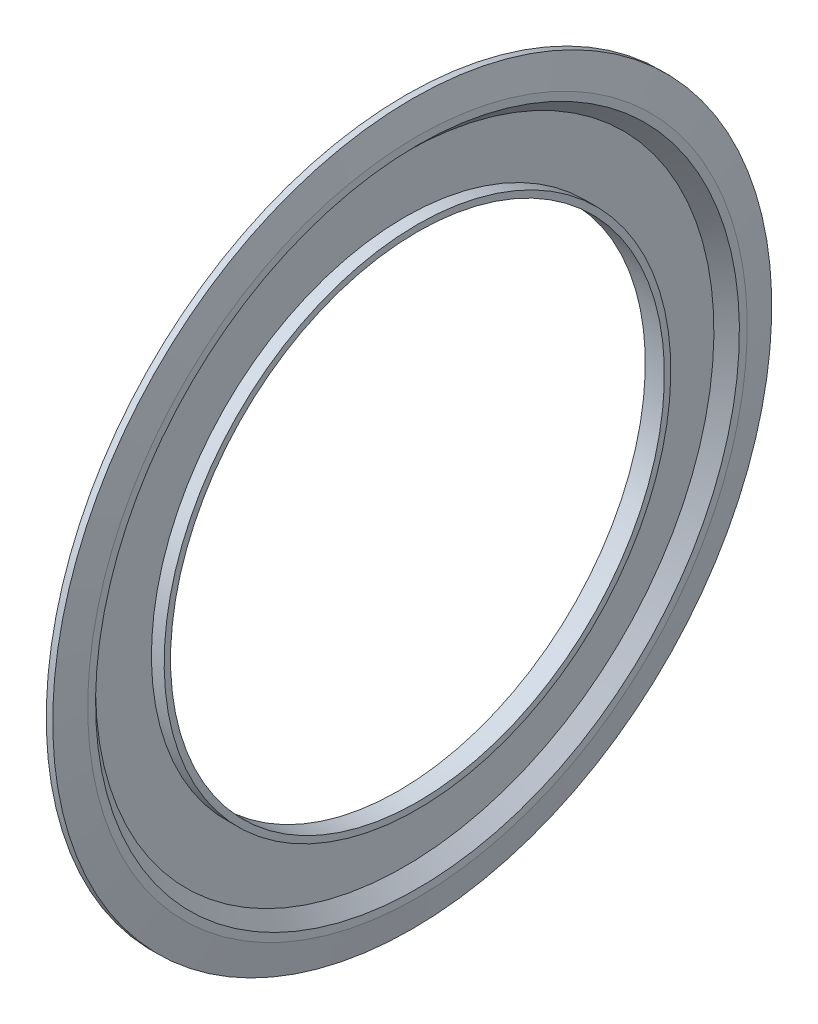
ISO-10303-21;
HEADER;
FILE_DESCRIPTION(('STEP AP214'),'2;1');
FILE_NAME('part.step','',(''),(''),'','','');
FILE_SCHEMA(('AUTOMOTIVE_DESIGN { 1 0 10303 214 1 1 1 1 }'));
ENDSEC;
DATA;
#1=APPLICATION_CONTEXT('core data for automotive mechanical design processes');
#2=APPLICATION_PROTOCOL_DEFINITION('international standard','automotive_design',2000,#1);
#3=PRODUCT_CONTEXT('',#1,'mechanical');
#4=PRODUCT('Part','Part','',(#3));
#5=PRODUCT_RELATED_PRODUCT_CATEGORY('part','',(#4));
#6=PRODUCT_DEFINITION_FORMATION('','',#4);
#7=PRODUCT_DEFINITION_CONTEXT('part definition',#1,'design');
#8=PRODUCT_DEFINITION('design','',#6,#7);
#9=PRODUCT_DEFINITION_SHAPE('','',#8);
#10=(LENGTH_UNIT() NAMED_UNIT(*) SI_UNIT(.MILLI.,.METRE.));
#11=(NAMED_UNIT(*) PLANE_ANGLE_UNIT() SI_UNIT($,.RADIAN.));
#12=(NAMED_UNIT(*) SI_UNIT($,.STERADIAN.) SOLID_ANGLE_UNIT());
#13=UNCERTAINTY_MEASURE_WITH_UNIT(LENGTH_MEASURE(1.E-05),#10,'distance_accuracy_value','');
#14=(GEOMETRIC_REPRESENTATION_CONTEXT(3) GLOBAL_UNCERTAINTY_ASSIGNED_CONTEXT((#13)) GLOBAL_UNIT_ASSIGNED_CONTEXT((#10,
#11,#12)) REPRESENTATION_CONTEXT('',''));
#15=CARTESIAN_POINT('',(0.,0.,0.));
#16=DIRECTION('',(0.,0.,1.));
#17=DIRECTION('',(1.,0.,0.));
#18=AXIS2_PLACEMENT_3D('',#15,#16,#17);
#19=CARTESIAN_POINT('',(1.11496576878358,14.5745,0.));
#20=DIRECTION('',(1.,0.,0.));
#21=DIRECTION('',(0.,-1.,0.));
#22=AXIS2_PLACEMENT_3D('',#19,#20,#21);
#23=PLANE('',#22);
#24=CARTESIAN_POINT('',(1.11496576878358,0.,0.));
#25=DIRECTION('',(-1.,0.,0.));
#26=DIRECTION('',(0.,1.,0.));
#27=AXIS2_PLACEMENT_3D('',#24,#25,#26);
#28=CIRCLE('',#27,14.399);
#29=CARTESIAN_POINT('',(1.11496576878358,14.399,0.));
#30=VERTEX_POINT('',#29);
#31=EDGE_CURVE('E11',#30,#30,#28,.T.);
#32=ORIENTED_EDGE('',*,*,#31,.T.);
#33=EDGE_LOOP('',(#32));
#34=FACE_BOUND('',#33,.T.);
#35=CARTESIAN_POINT('',(1.11496576878358,0.,0.));
#36=DIRECTION('',(-1.,0.,0.));
#37=DIRECTION('',(0.,1.,0.));
#38=AXIS2_PLACEMENT_3D('',#35,#36,#37);
#39=CIRCLE('',#38,14.75);
#40=CARTESIAN_POINT('',(1.11496576878358,14.75,0.));
#41=VERTEX_POINT('',#40);
#42=EDGE_CURVE('E62',#41,#41,#39,.T.);
#43=ORIENTED_EDGE('',*,*,#42,.F.);
#44=EDGE_LOOP('',(#43));
#45=FACE_BOUND('',#44,.T.);
#46=ADVANCED_FACE('F16',(#34,#45),#23,.T.);
#47=CARTESIAN_POINT('',(0.829965768783582,0.,0.));
#48=DIRECTION('',(1.,0.,0.));
#49=DIRECTION('',(0.,1.,0.));
#50=AXIS2_PLACEMENT_3D('',#47,#48,#49);
#51=CONICAL_SURFACE('',#50,14.114,0.785398163397446);
#52=CARTESIAN_POINT('',(0.544965768783584,0.,0.));
#53=DIRECTION('',(-1.,0.,0.));
#54=DIRECTION('',(0.,1.,0.));
#55=AXIS2_PLACEMENT_3D('',#52,#53,#54);
#56=CIRCLE('',#55,13.829);
#57=CARTESIAN_POINT('',(0.544965768783584,13.829,0.));
#58=VERTEX_POINT('',#57);
#59=EDGE_CURVE('E26',#58,#58,#56,.T.);
#60=ORIENTED_EDGE('',*,*,#59,.T.);
#61=EDGE_LOOP('',(#60));
#62=FACE_BOUND('',#61,.T.);
#63=ORIENTED_EDGE('',*,*,#31,.F.);
#64=EDGE_LOOP('',(#63));
#65=FACE_BOUND('',#64,.T.);
#66=ADVANCED_FACE('F84',(#62,#65),#51,.F.);
#67=CARTESIAN_POINT('',(0.544965768783584,12.5795,0.));
#68=DIRECTION('',(1.,0.,0.));
#69=DIRECTION('',(0.,-1.,0.));
#70=AXIS2_PLACEMENT_3D('',#67,#68,#69);
#71=PLANE('',#70);
#72=CARTESIAN_POINT('',(0.544965768783582,0.,0.));
#73=DIRECTION('',(-1.,0.,0.));
#74=DIRECTION('',(0.,1.,0.));
#75=AXIS2_PLACEMENT_3D('',#72,#73,#74);
#76=CIRCLE('',#75,11.33);
#77=CARTESIAN_POINT('',(0.544965768783582,11.33,0.));
#78=VERTEX_POINT('',#77);
#79=EDGE_CURVE('E68',#78,#78,#76,.T.);
#80=ORIENTED_EDGE('',*,*,#79,.T.);
#81=EDGE_LOOP('',(#80));
#82=FACE_BOUND('',#81,.T.);
#83=ORIENTED_EDGE('',*,*,#59,.F.);
#84=EDGE_LOOP('',(#83));
#85=FACE_BOUND('',#84,.T.);
#86=ADVANCED_FACE('F87',(#82,#85),#71,.T.);
#87=CARTESIAN_POINT('',(0.829965768783582,0.,0.));
#88=DIRECTION('',(1.,0.,0.));
#89=DIRECTION('',(0.,1.,0.));
#90=AXIS2_PLACEMENT_3D('',#87,#88,#89);
#91=CYLINDRICAL_SURFACE('',#90,11.33);
#92=CARTESIAN_POINT('',(1.11496576878358,0.,0.));
#93=DIRECTION('',(-1.,0.,0.));
#94=DIRECTION('',(0.,1.,0.));
#95=AXIS2_PLACEMENT_3D('',#92,#93,#94);
#96=CIRCLE('',#95,11.33);
#97=CARTESIAN_POINT('',(1.11496576878358,11.33,0.));
#98=VERTEX_POINT('',#97);
#99=EDGE_CURVE('E70',#98,#98,#96,.T.);
#100=ORIENTED_EDGE('',*,*,#99,.T.);
#101=EDGE_LOOP('',(#100));
#102=FACE_BOUND('',#101,.T.);
#103=ORIENTED_EDGE('',*,*,#79,.F.);
#104=EDGE_LOOP('',(#103));
#105=FACE_BOUND('',#104,.T.);
#106=ADVANCED_FACE('F89',(#102,#105),#91,.T.);
#107=CARTESIAN_POINT('',(1.11496576878358,11.1875,0.));
#108=DIRECTION('',(1.,0.,0.));
#109=DIRECTION('',(0.,-1.,0.));
#110=AXIS2_PLACEMENT_3D('',#107,#108,#109);
#111=PLANE('',#110);
#112=CARTESIAN_POINT('',(1.11496576878358,0.,0.));
#113=DIRECTION('',(-1.,0.,0.));
#114=DIRECTION('',(0.,1.,0.));
#115=AXIS2_PLACEMENT_3D('',#112,#113,#114);
#116=CIRCLE('',#115,11.045);
#117=CARTESIAN_POINT('',(1.11496576878358,11.045,0.));
#118=VERTEX_POINT('',#117);
#119=EDGE_CURVE('E67',#118,#118,#116,.T.);
#120=ORIENTED_EDGE('',*,*,#119,.T.);
#121=EDGE_LOOP('',(#120));
#122=FACE_BOUND('',#121,.T.);
#123=ORIENTED_EDGE('',*,*,#99,.F.);
#124=EDGE_LOOP('',(#123));
#125=FACE_BOUND('',#124,.T.);
#126=ADVANCED_FACE('F97',(#122,#125),#111,.T.);
#127=CARTESIAN_POINT('',(0.687465768783582,0.,0.));
#128=DIRECTION('',(1.,0.,0.));
#129=DIRECTION('',(0.,1.,0.));
#130=AXIS2_PLACEMENT_3D('',#127,#128,#129);
#131=CYLINDRICAL_SURFACE('',#130,11.045);
#132=CARTESIAN_POINT('',(0.259965768783583,0.,0.));
#133=DIRECTION('',(-1.,0.,0.));
#134=DIRECTION('',(0.,1.,0.));
#135=AXIS2_PLACEMENT_3D('',#132,#133,#134);
#136=CIRCLE('',#135,11.045);
#137=CARTESIAN_POINT('',(0.259965768783583,11.045,0.));
#138=VERTEX_POINT('',#137);
#139=EDGE_CURVE('E79',#138,#138,#136,.T.);
#140=ORIENTED_EDGE('',*,*,#139,.T.);
#141=EDGE_LOOP('',(#140));
#142=FACE_BOUND('',#141,.T.);
#143=ORIENTED_EDGE('',*,*,#119,.F.);
#144=EDGE_LOOP('',(#143));
#145=FACE_BOUND('',#144,.T.);
#146=ADVANCED_FACE('F108',(#142,#145),#131,.F.);
#147=CARTESIAN_POINT('',(0.259965768783583,12.4960254326382,0.));
#148=DIRECTION('',(-1.,0.,0.));
#149=DIRECTION('',(0.,1.,0.));
#150=AXIS2_PLACEMENT_3D('',#147,#148,#149);
#151=PLANE('',#150);
#152=CARTESIAN_POINT('',(0.259965768783583,0.,0.));
#153=DIRECTION('',(-1.,0.,0.));
#154=DIRECTION('',(0.,1.,0.));
#155=AXIS2_PLACEMENT_3D('',#152,#153,#154);
#156=CIRCLE('',#155,13.9470508652763);
#157=CARTESIAN_POINT('',(0.259965768783583,13.9470508652763,0.));
#158=VERTEX_POINT('',#157);
#159=EDGE_CURVE('E20',#158,#158,#156,.T.);
#160=ORIENTED_EDGE('',*,*,#159,.T.);
#161=EDGE_LOOP('',(#160));
#162=FACE_BOUND('',#161,.T.);
#163=ORIENTED_EDGE('',*,*,#139,.F.);
#164=EDGE_LOOP('',(#163));
#165=FACE_BOUND('',#164,.T.);
#166=ADVANCED_FACE('F110',(#162,#165),#151,.T.);
#167=CARTESIAN_POINT('',(0.544965768783584,0.,0.));
#168=DIRECTION('',(1.,0.,0.));
#169=DIRECTION('',(0.,1.,0.));
#170=AXIS2_PLACEMENT_3D('',#167,#168,#169);
#171=CONICAL_SURFACE('',#170,14.2320508652763,0.785398163397446);
#172=CARTESIAN_POINT('',(0.829965768783582,0.,0.));
#173=DIRECTION('',(-1.,0.,0.));
#174=DIRECTION('',(0.,1.,0.));
#175=AXIS2_PLACEMENT_3D('',#172,#173,#174);
#176=CIRCLE('',#175,14.5170508652763);
#177=CARTESIAN_POINT('',(0.829965768783582,14.5170508652763,0.));
#178=VERTEX_POINT('',#177);
#179=EDGE_CURVE('E74',#178,#178,#176,.T.);
#180=ORIENTED_EDGE('',*,*,#179,.T.);
#181=EDGE_LOOP('',(#180));
#182=FACE_BOUND('',#181,.T.);
#183=ORIENTED_EDGE('',*,*,#159,.F.);
#184=EDGE_LOOP('',(#183));
#185=FACE_BOUND('',#184,.T.);
#186=ADVANCED_FACE('F113',(#182,#185),#171,.T.);
#187=CARTESIAN_POINT('',(0.829965768783582,14.6210582980857,0.));
#188=DIRECTION('',(-1.,0.,0.));
#189=DIRECTION('',(0.,1.,0.));
#190=AXIS2_PLACEMENT_3D('',#187,#188,#189);
#191=PLANE('',#190);
#192=CARTESIAN_POINT('',(0.829965768783582,0.,0.));
#193=DIRECTION('',(-1.,0.,0.));
#194=DIRECTION('',(0.,1.,0.));
#195=AXIS2_PLACEMENT_3D('',#192,#193,#194);
#196=CIRCLE('',#195,14.7250657308951);
#197=CARTESIAN_POINT('',(0.829965768783582,14.7250657308951,0.));
#198=VERTEX_POINT('',#197);
#199=EDGE_CURVE('E72',#198,#198,#196,.T.);
#200=ORIENTED_EDGE('',*,*,#199,.T.);
#201=EDGE_LOOP('',(#200));
#202=FACE_BOUND('',#201,.T.);
#203=ORIENTED_EDGE('',*,*,#179,.F.);
#204=EDGE_LOOP('',(#203));
#205=FACE_BOUND('',#204,.T.);
#206=ADVANCED_FACE('F18',(#202,#205),#191,.T.);
#207=CARTESIAN_POINT('',(0.710510034418736,0.,0.));
#208=DIRECTION('',(-1.,0.,0.));
#209=DIRECTION('',(0.,1.,0.));
#210=AXIS2_PLACEMENT_3D('',#207,#208,#209);
#211=CONICAL_SURFACE('',#210,15.4025328654476,1.39626340159546);
#212=CARTESIAN_POINT('',(0.591054300053887,0.,0.));
#213=DIRECTION('',(-1.,0.,0.));
#214=DIRECTION('',(0.,1.,0.));
#215=AXIS2_PLACEMENT_3D('',#212,#213,#214);
#216=CIRCLE('',#215,16.08);
#217=CARTESIAN_POINT('',(0.591054300053887,16.08,0.));
#218=VERTEX_POINT('',#217);
#219=EDGE_CURVE('E64',#218,#218,#216,.T.);
#220=ORIENTED_EDGE('',*,*,#219,.T.);
#221=EDGE_LOOP('',(#220));
#222=FACE_BOUND('',#221,.T.);
#223=ORIENTED_EDGE('',*,*,#199,.F.);
#224=EDGE_LOOP('',(#223));
#225=FACE_BOUND('',#224,.T.);
#226=ADVANCED_FACE('F123',(#222,#225),#211,.F.);
#227=CARTESIAN_POINT('',(0.735752592247605,0.,0.));
#228=DIRECTION('',(1.,0.,0.));
#229=DIRECTION('',(0.,1.,0.));
#230=AXIS2_PLACEMENT_3D('',#227,#228,#229);
#231=CYLINDRICAL_SURFACE('',#230,16.08);
#232=CARTESIAN_POINT('',(0.880450884441324,0.,0.));
#233=DIRECTION('',(-1.,0.,0.));
#234=DIRECTION('',(0.,1.,0.));
#235=AXIS2_PLACEMENT_3D('',#232,#233,#234);
#236=CIRCLE('',#235,16.08);
#237=CARTESIAN_POINT('',(0.880450884441324,16.08,0.));
#238=VERTEX_POINT('',#237);
#239=EDGE_CURVE('E58',#238,#238,#236,.T.);
#240=ORIENTED_EDGE('',*,*,#239,.T.);
#241=EDGE_LOOP('',(#240));
#242=FACE_BOUND('',#241,.T.);
#243=ORIENTED_EDGE('',*,*,#219,.F.);
#244=EDGE_LOOP('',(#243));
#245=FACE_BOUND('',#244,.T.);
#246=ADVANCED_FACE('F59',(#242,#245),#231,.T.);
#247=CARTESIAN_POINT('',(0.997708326612454,0.,0.));
#248=DIRECTION('',(-1.,0.,0.));
#249=DIRECTION('',(0.,1.,0.));
#250=AXIS2_PLACEMENT_3D('',#247,#248,#249);
#251=CONICAL_SURFACE('',#250,15.415,1.39626340159546);
#252=ORIENTED_EDGE('',*,*,#42,.T.);
#253=EDGE_LOOP('',(#252));
#254=FACE_BOUND('',#253,.T.);
#255=ORIENTED_EDGE('',*,*,#239,.F.);
#256=EDGE_LOOP('',(#255));
#257=FACE_BOUND('',#256,.T.);
#258=ADVANCED_FACE('F122',(#254,#257),#251,.T.);
#259=CLOSED_SHELL('',(#46,#66,#86,#106,#126,#146,#166,#186,#206,#226,#246,#258));
#260=MANIFOLD_SOLID_BREP('B1',#259);
#261=ADVANCED_BREP_SHAPE_REPRESENTATION('',(#18,#260),#14);
#262=SHAPE_DEFINITION_REPRESENTATION(#9,#261);
ENDSEC;
END-ISO-10303-21;
